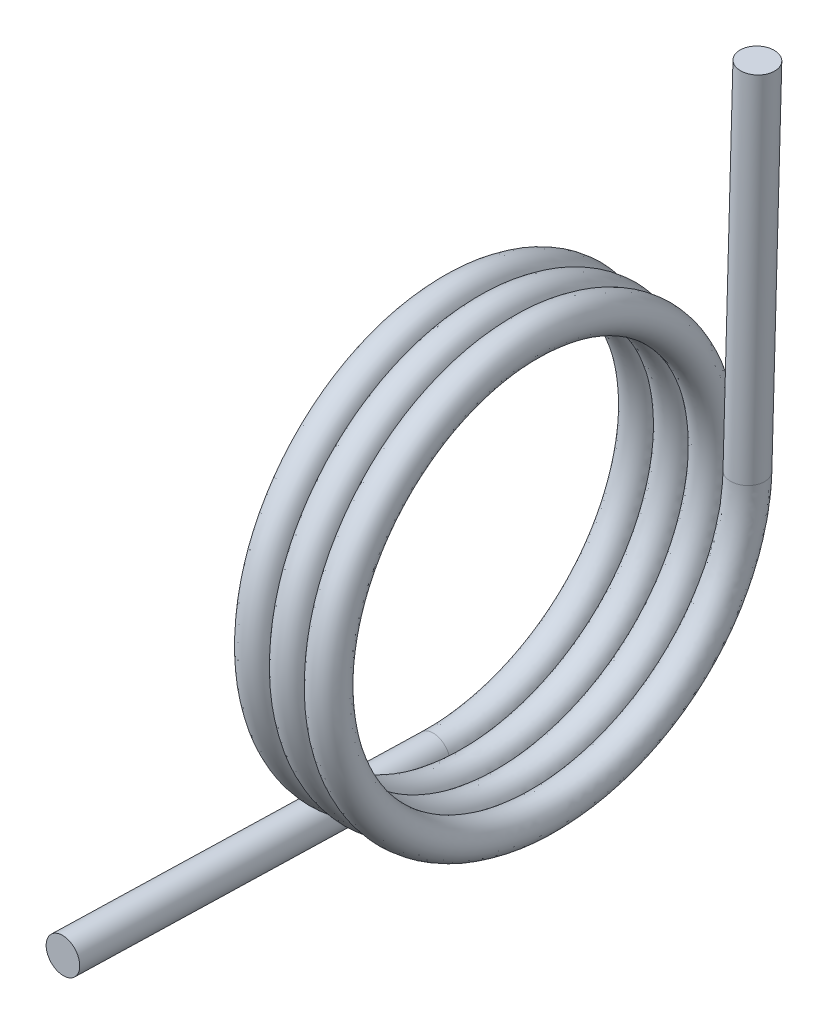
ISO-10303-21;
HEADER;
FILE_DESCRIPTION(('STEP AP214'),'2;1');
FILE_NAME('part.step','',(''),(''),'','','');
FILE_SCHEMA(('AUTOMOTIVE_DESIGN { 1 0 10303 214 1 1 1 1 }'));
ENDSEC;
DATA;
#1=APPLICATION_CONTEXT('core data for automotive mechanical design processes');
#2=APPLICATION_PROTOCOL_DEFINITION('international standard','automotive_design',2000,#1);
#3=PRODUCT_CONTEXT('',#1,'mechanical');
#4=PRODUCT('Part','Part','',(#3));
#5=PRODUCT_RELATED_PRODUCT_CATEGORY('part','',(#4));
#6=PRODUCT_DEFINITION_FORMATION('','',#4);
#7=PRODUCT_DEFINITION_CONTEXT('part definition',#1,'design');
#8=PRODUCT_DEFINITION('design','',#6,#7);
#9=PRODUCT_DEFINITION_SHAPE('','',#8);
#10=(LENGTH_UNIT() NAMED_UNIT(*) SI_UNIT(.MILLI.,.METRE.));
#11=(NAMED_UNIT(*) PLANE_ANGLE_UNIT() SI_UNIT($,.RADIAN.));
#12=(NAMED_UNIT(*) SI_UNIT($,.STERADIAN.) SOLID_ANGLE_UNIT());
#13=UNCERTAINTY_MEASURE_WITH_UNIT(LENGTH_MEASURE(1.E-05),#10,'distance_accuracy_value','');
#14=(GEOMETRIC_REPRESENTATION_CONTEXT(3) GLOBAL_UNCERTAINTY_ASSIGNED_CONTEXT((#13)) GLOBAL_UNIT_ASSIGNED_CONTEXT((#10,
#11,#12)) REPRESENTATION_CONTEXT('',''));
#15=CARTESIAN_POINT('',(0.,0.,0.));
#16=DIRECTION('',(0.,0.,1.));
#17=DIRECTION('',(1.,0.,0.));
#18=AXIS2_PLACEMENT_3D('',#15,#16,#17);
#19=CARTESIAN_POINT('',(-1.45994168900246,-16.9545,-0.0403796323986165));
#20=CARTESIAN_POINT('',(-1.21440835566913,-16.9311868083649,-9.82906477137413));
#21=CARTESIAN_POINT('',(-0.968875022335798,-8.44228021254733,-14.7032175246626));
#22=CARTESIAN_POINT('',(-0.723341689002465,0.0466263832702375,-19.577370277951));
#23=CARTESIAN_POINT('',(-0.477808355669133,8.51221978745268,-14.662837892264));
#24=CARTESIAN_POINT('',(-0.2322750223358,16.9778131916351,-9.7483055065769));
#25=CARTESIAN_POINT('',(0.013258310997533,16.9545,0.0403796323986144));
#26=CARTESIAN_POINT('',(0.258791644330866,16.9311868083649,9.82906477137412));
#27=CARTESIAN_POINT('',(0.504324977664198,8.44228021254733,14.7032175246626));
#28=CARTESIAN_POINT('',(0.749858310997531,-0.0466263832702351,19.577370277951));
#29=CARTESIAN_POINT('',(0.995391644330864,-8.51221978745267,14.662837892264));
#30=CARTESIAN_POINT('',(1.2409249776642,-16.9778131916351,9.74830550657691));
#31=CARTESIAN_POINT('',(1.48645831099753,-16.9545,-0.0403796323986165));
#32=CARTESIAN_POINT('',(1.73199164433086,-16.9311868083649,-9.82906477137413));
#33=CARTESIAN_POINT('',(1.97752497766419,-8.44228021254733,-14.7032175246626));
#34=CARTESIAN_POINT('',(2.22305831099753,0.0466263832702375,-19.577370277951));
#35=CARTESIAN_POINT('',(2.46859164433086,8.51221978745268,-14.662837892264));
#36=CARTESIAN_POINT('',(2.71412497766419,16.9778131916351,-9.7483055065769));
#37=CARTESIAN_POINT('',(2.95965831099753,16.9545,0.0403796323986144));
#38=CARTESIAN_POINT('',(3.20519164433086,16.9311868083649,9.82906477137412));
#39=CARTESIAN_POINT('',(3.45072497766419,8.44228021254733,14.7032175246626));
#40=CARTESIAN_POINT('',(3.69625831099752,-0.0466263832702351,19.577370277951));
#41=CARTESIAN_POINT('',(3.94179164433086,-8.51221978745267,14.662837892264));
#42=CARTESIAN_POINT('',(4.18732497766419,-16.9778131916351,9.74830550657691));
#43=CARTESIAN_POINT('',(4.43285831099752,-16.9545,-0.0403796323986165));
#44=CARTESIAN_POINT('',(4.67839164433085,-16.9311868083649,-9.82906477137413));
#45=CARTESIAN_POINT('',(4.92392497766419,-8.44228021254733,-14.7032175246626));
#46=CARTESIAN_POINT('',(5.16945831099752,0.0466263832702375,-19.577370277951));
#47=CARTESIAN_POINT('',(5.41499164433085,8.51221978745268,-14.662837892264));
#48=CARTESIAN_POINT('',(5.66052497766419,16.9778131916351,-9.7483055065769));
#49=CARTESIAN_POINT('',(5.90605831099752,16.9545,0.0403796323986144));
#50=CARTESIAN_POINT('',(6.15159164433085,16.9311868083649,9.82906477137412));
#51=CARTESIAN_POINT('',(6.39712497766418,8.44228021254733,14.7032175246626));
#52=CARTESIAN_POINT('',(6.64265831099752,-0.0466263832702351,19.577370277951));
#53=CARTESIAN_POINT('',(6.88819164433085,-8.51221978745267,14.662837892264));
#54=CARTESIAN_POINT('',(7.13372497766418,-16.9778131916351,9.74830550657691));
#55=CARTESIAN_POINT('',(7.37925831099752,-16.9545,-0.0403796323986165));
#56=CARTESIAN_POINT('',(7.62479164433085,-16.9311868083649,-9.82906477137413));
#57=CARTESIAN_POINT('',(7.87032497766418,-8.44228021254733,-14.7032175246626));
#58=CARTESIAN_POINT('',(8.11585831099752,0.0466263832702375,-19.577370277951));
#59=CARTESIAN_POINT('',(8.36139164433085,8.51221978745268,-14.662837892264));
#60=CARTESIAN_POINT('',(8.60692497766418,16.9778131916351,-9.7483055065769));
#61=CARTESIAN_POINT('',(8.85245831099751,16.9545,0.0403796323986144));
#62=CARTESIAN_POINT('',(9.09799164433085,16.9311868083649,9.82906477137412));
#63=CARTESIAN_POINT('',(9.34352497766418,8.44228021254733,14.7032175246626));
#64=CARTESIAN_POINT('',(9.58905831099751,-0.0466263832702351,19.577370277951));
#65=CARTESIAN_POINT('',(9.83459164433084,-8.51221978745267,14.662837892264));
#66=CARTESIAN_POINT('',(10.0801249776642,-16.9778131916351,9.74830550657691));
#67=CARTESIAN_POINT('',(10.3256583109975,-16.9545,-0.0403796323986165));
#68=CARTESIAN_POINT('',(-1.45994168900246,-14.0335,-0.0403796323985853));
#69=CARTESIAN_POINT('',(-1.21440835566913,-14.0101868083649,-8.1426246350712));
#70=CARTESIAN_POINT('',(-0.968875022335799,-6.98178021254735,-12.1735573202082));
#71=CARTESIAN_POINT('',(-0.723341689002466,0.0466263832702018,-16.2044900053452));
#72=CARTESIAN_POINT('',(-0.477808355669133,7.05171978745265,-12.1331776878096));
#73=CARTESIAN_POINT('',(-0.232275022335801,14.0568131916351,-8.06186537027403));
#74=CARTESIAN_POINT('',(0.0132583109975321,14.0335,0.0403796323985836));
#75=CARTESIAN_POINT('',(0.258791644330865,14.0101868083649,8.1426246350712));
#76=CARTESIAN_POINT('',(0.504324977664198,6.98178021254736,12.1735573202082));
#77=CARTESIAN_POINT('',(0.749858310997531,-0.0466263832701998,16.2044900053452));
#78=CARTESIAN_POINT('',(0.995391644330863,-7.05171978745265,12.1331776878096));
#79=CARTESIAN_POINT('',(1.2409249776642,-14.0568131916351,8.06186537027404));
#80=CARTESIAN_POINT('',(1.48645831099753,-14.0335,-0.0403796323985853));
#81=CARTESIAN_POINT('',(1.73199164433086,-14.0101868083649,-8.1426246350712));
#82=CARTESIAN_POINT('',(1.97752497766419,-6.98178021254735,-12.1735573202082));
#83=CARTESIAN_POINT('',(2.22305831099753,0.0466263832702018,-16.2044900053452));
#84=CARTESIAN_POINT('',(2.46859164433086,7.05171978745265,-12.1331776878096));
#85=CARTESIAN_POINT('',(2.71412497766419,14.0568131916351,-8.06186537027403));
#86=CARTESIAN_POINT('',(2.95965831099753,14.0335,0.0403796323985836));
#87=CARTESIAN_POINT('',(3.20519164433086,14.0101868083649,8.1426246350712));
#88=CARTESIAN_POINT('',(3.45072497766419,6.98178021254736,12.1735573202082));
#89=CARTESIAN_POINT('',(3.69625831099752,-0.0466263832701998,16.2044900053452));
#90=CARTESIAN_POINT('',(3.94179164433086,-7.05171978745265,12.1331776878096));
#91=CARTESIAN_POINT('',(4.18732497766419,-14.0568131916351,8.06186537027404));
#92=CARTESIAN_POINT('',(4.43285831099752,-14.0335,-0.0403796323985853));
#93=CARTESIAN_POINT('',(4.67839164433085,-14.0101868083649,-8.1426246350712));
#94=CARTESIAN_POINT('',(4.92392497766419,-6.98178021254735,-12.1735573202082));
#95=CARTESIAN_POINT('',(5.16945831099752,0.0466263832702018,-16.2044900053452));
#96=CARTESIAN_POINT('',(5.41499164433085,7.05171978745265,-12.1331776878096));
#97=CARTESIAN_POINT('',(5.66052497766418,14.0568131916351,-8.06186537027403));
#98=CARTESIAN_POINT('',(5.90605831099752,14.0335,0.0403796323985836));
#99=CARTESIAN_POINT('',(6.15159164433085,14.0101868083649,8.1426246350712));
#100=CARTESIAN_POINT('',(6.39712497766418,6.98178021254736,12.1735573202082));
#101=CARTESIAN_POINT('',(6.64265831099752,-0.0466263832701998,16.2044900053452));
#102=CARTESIAN_POINT('',(6.88819164433085,-7.05171978745265,12.1331776878096));
#103=CARTESIAN_POINT('',(7.13372497766418,-14.0568131916351,8.06186537027404));
#104=CARTESIAN_POINT('',(7.37925831099751,-14.0335,-0.0403796323985853));
#105=CARTESIAN_POINT('',(7.62479164433085,-14.0101868083649,-8.1426246350712));
#106=CARTESIAN_POINT('',(7.87032497766418,-6.98178021254735,-12.1735573202082));
#107=CARTESIAN_POINT('',(8.11585831099752,0.0466263832702018,-16.2044900053452));
#108=CARTESIAN_POINT('',(8.36139164433085,7.05171978745265,-12.1331776878096));
#109=CARTESIAN_POINT('',(8.60692497766418,14.0568131916351,-8.06186537027403));
#110=CARTESIAN_POINT('',(8.85245831099751,14.0335,0.0403796323985836));
#111=CARTESIAN_POINT('',(9.09799164433085,14.0101868083649,8.1426246350712));
#112=CARTESIAN_POINT('',(9.34352497766418,6.98178021254736,12.1735573202082));
#113=CARTESIAN_POINT('',(9.58905831099751,-0.0466263832701998,16.2044900053452));
#114=CARTESIAN_POINT('',(9.83459164433084,-7.05171978745265,12.1331776878096));
#115=CARTESIAN_POINT('',(10.0801249776642,-14.0568131916351,8.06186537027404));
#116=CARTESIAN_POINT('',(10.3256583109975,-14.0335,-0.0403796323985853));
#117=CARTESIAN_POINT('',(1.45994168900246,-14.0335,0.0403796323982925));
#118=CARTESIAN_POINT('',(1.7054750223358,-14.0568131916349,-8.06186537027432));
#119=CARTESIAN_POINT('',(1.95100835566913,-7.0517197874524,-12.1331776878098));
#120=CARTESIAN_POINT('',(2.19654168900246,-0.0466263832698656,-16.2044900053452));
#121=CARTESIAN_POINT('',(2.44207502233579,6.9817802125476,-12.1735573202081));
#122=CARTESIAN_POINT('',(2.68760835566913,14.0101868083651,-8.14262463507091));
#123=CARTESIAN_POINT('',(2.93314168900246,14.0335,-0.0403796323982942));
#124=CARTESIAN_POINT('',(3.17867502233579,14.0568131916349,8.06186537027432));
#125=CARTESIAN_POINT('',(3.42420835566913,7.05171978745241,12.1331776878098));
#126=CARTESIAN_POINT('',(3.66974168900246,0.0466263832698676,16.2044900053452));
#127=CARTESIAN_POINT('',(3.91527502233579,-6.98178021254759,12.1735573202081));
#128=CARTESIAN_POINT('',(4.16080835566912,-14.0101868083651,8.14262463507092));
#129=CARTESIAN_POINT('',(4.40634168900246,-14.0335,0.0403796323982925));
#130=CARTESIAN_POINT('',(4.65187502233579,-14.0568131916349,-8.06186537027432));
#131=CARTESIAN_POINT('',(4.89740835566912,-7.0517197874524,-12.1331776878098));
#132=CARTESIAN_POINT('',(5.14294168900245,-0.0466263832698656,-16.2044900053452));
#133=CARTESIAN_POINT('',(5.38847502233579,6.9817802125476,-12.1735573202081));
#134=CARTESIAN_POINT('',(5.63400835566912,14.0101868083651,-8.14262463507091));
#135=CARTESIAN_POINT('',(5.87954168900245,14.0335,-0.0403796323982942));
#136=CARTESIAN_POINT('',(6.12507502233579,14.0568131916349,8.06186537027432));
#137=CARTESIAN_POINT('',(6.37060835566912,7.05171978745241,12.1331776878098));
#138=CARTESIAN_POINT('',(6.61614168900245,0.0466263832698676,16.2044900053452));
#139=CARTESIAN_POINT('',(6.86167502233578,-6.98178021254759,12.1735573202081));
#140=CARTESIAN_POINT('',(7.10720835566912,-14.0101868083651,8.14262463507092));
#141=CARTESIAN_POINT('',(7.35274168900245,-14.0335,0.0403796323982925));
#142=CARTESIAN_POINT('',(7.59827502233578,-14.0568131916349,-8.06186537027432));
#143=CARTESIAN_POINT('',(7.84380835566911,-7.0517197874524,-12.1331776878098));
#144=CARTESIAN_POINT('',(8.08934168900245,-0.0466263832698656,-16.2044900053452));
#145=CARTESIAN_POINT('',(8.33487502233578,6.9817802125476,-12.1735573202081));
#146=CARTESIAN_POINT('',(8.58040835566911,14.0101868083651,-8.14262463507091));
#147=CARTESIAN_POINT('',(8.82594168900245,14.0335,-0.0403796323982942));
#148=CARTESIAN_POINT('',(9.07147502233578,14.0568131916349,8.06186537027432));
#149=CARTESIAN_POINT('',(9.31700835566911,7.05171978745241,12.1331776878098));
#150=CARTESIAN_POINT('',(9.56254168900244,0.0466263832698676,16.2044900053452));
#151=CARTESIAN_POINT('',(9.80807502233577,-6.98178021254759,12.1735573202081));
#152=CARTESIAN_POINT('',(10.0536083556691,-14.0101868083651,8.14262463507092));
#153=CARTESIAN_POINT('',(10.2991416890024,-14.0335,0.0403796323982925));
#154=CARTESIAN_POINT('',(10.5446750223358,-14.0568131916349,-8.06186537027432));
#155=CARTESIAN_POINT('',(10.7902083556691,-7.0517197874524,-12.1331776878098));
#156=CARTESIAN_POINT('',(11.0357416890024,-0.0466263832698656,-16.2044900053452));
#157=CARTESIAN_POINT('',(11.2812750223358,6.9817802125476,-12.1735573202081));
#158=CARTESIAN_POINT('',(11.5268083556691,14.0101868083651,-8.14262463507091));
#159=CARTESIAN_POINT('',(11.7723416890024,14.0335,-0.0403796323982942));
#160=CARTESIAN_POINT('',(12.0178750223358,14.0568131916349,8.06186537027432));
#161=CARTESIAN_POINT('',(12.2634083556691,7.05171978745241,12.1331776878098));
#162=CARTESIAN_POINT('',(12.5089416890024,0.0466263832698676,16.2044900053452));
#163=CARTESIAN_POINT('',(12.7544750223358,-6.98178021254759,12.1735573202081));
#164=CARTESIAN_POINT('',(13.0000083556691,-14.0101868083651,8.14262463507092));
#165=CARTESIAN_POINT('',(13.2455416890024,-14.0335,0.0403796323982925));
#166=CARTESIAN_POINT('',(1.45994168900246,-16.9545,0.0403796323982613));
#167=CARTESIAN_POINT('',(1.7054750223358,-16.9778131916349,-9.74830550657725));
#168=CARTESIAN_POINT('',(1.95100835566913,-8.51221978745238,-14.6628378922641));
#169=CARTESIAN_POINT('',(2.19654168900246,-0.0466263832698298,-19.577370277951));
#170=CARTESIAN_POINT('',(2.44207502233579,8.44228021254763,-14.7032175246624));
#171=CARTESIAN_POINT('',(2.68760835566913,16.9311868083651,-9.82906477137378));
#172=CARTESIAN_POINT('',(2.93314168900246,16.9545,-0.0403796323982634));
#173=CARTESIAN_POINT('',(3.17867502233579,16.9778131916349,9.74830550657725));
#174=CARTESIAN_POINT('',(3.42420835566913,8.51221978745238,14.6628378922641));
#175=CARTESIAN_POINT('',(3.66974168900246,0.0466263832698322,19.577370277951));
#176=CARTESIAN_POINT('',(3.91527502233579,-8.44228021254762,14.7032175246624));
#177=CARTESIAN_POINT('',(4.16080835566912,-16.9311868083651,9.82906477137378));
#178=CARTESIAN_POINT('',(4.40634168900246,-16.9545,0.0403796323982613));
#179=CARTESIAN_POINT('',(4.65187502233579,-16.9778131916349,-9.74830550657725));
#180=CARTESIAN_POINT('',(4.89740835566912,-8.51221978745238,-14.6628378922641));
#181=CARTESIAN_POINT('',(5.14294168900246,-0.0466263832698298,-19.577370277951));
#182=CARTESIAN_POINT('',(5.38847502233579,8.44228021254763,-14.7032175246624));
#183=CARTESIAN_POINT('',(5.63400835566912,16.9311868083651,-9.82906477137378));
#184=CARTESIAN_POINT('',(5.87954168900245,16.9545,-0.0403796323982634));
#185=CARTESIAN_POINT('',(6.12507502233579,16.9778131916349,9.74830550657725));
#186=CARTESIAN_POINT('',(6.37060835566912,8.51221978745238,14.6628378922641));
#187=CARTESIAN_POINT('',(6.61614168900245,0.0466263832698322,19.577370277951));
#188=CARTESIAN_POINT('',(6.86167502233578,-8.44228021254762,14.7032175246624));
#189=CARTESIAN_POINT('',(7.10720835566912,-16.9311868083651,9.82906477137378));
#190=CARTESIAN_POINT('',(7.35274168900245,-16.9545,0.0403796323982613));
#191=CARTESIAN_POINT('',(7.59827502233578,-16.9778131916349,-9.74830550657725));
#192=CARTESIAN_POINT('',(7.84380835566912,-8.51221978745238,-14.6628378922641));
#193=CARTESIAN_POINT('',(8.08934168900245,-0.0466263832698298,-19.577370277951));
#194=CARTESIAN_POINT('',(8.33487502233578,8.44228021254763,-14.7032175246624));
#195=CARTESIAN_POINT('',(8.58040835566911,16.9311868083651,-9.82906477137378));
#196=CARTESIAN_POINT('',(8.82594168900245,16.9545,-0.0403796323982634));
#197=CARTESIAN_POINT('',(9.07147502233578,16.9778131916349,9.74830550657725));
#198=CARTESIAN_POINT('',(9.31700835566911,8.51221978745238,14.6628378922641));
#199=CARTESIAN_POINT('',(9.56254168900244,0.0466263832698322,19.577370277951));
#200=CARTESIAN_POINT('',(9.80807502233578,-8.44228021254762,14.7032175246624));
#201=CARTESIAN_POINT('',(10.0536083556691,-16.9311868083651,9.82906477137378));
#202=CARTESIAN_POINT('',(10.2991416890024,-16.9545,0.0403796323982613));
#203=CARTESIAN_POINT('',(10.5446750223358,-16.9778131916349,-9.74830550657725));
#204=CARTESIAN_POINT('',(10.7902083556691,-8.51221978745238,-14.6628378922641));
#205=CARTESIAN_POINT('',(11.0357416890024,-0.0466263832698298,-19.577370277951));
#206=CARTESIAN_POINT('',(11.2812750223358,8.44228021254763,-14.7032175246624));
#207=CARTESIAN_POINT('',(11.5268083556691,16.9311868083651,-9.82906477137378));
#208=CARTESIAN_POINT('',(11.7723416890024,16.9545,-0.0403796323982634));
#209=CARTESIAN_POINT('',(12.0178750223358,16.9778131916349,9.74830550657725));
#210=CARTESIAN_POINT('',(12.2634083556691,8.51221978745238,14.6628378922641));
#211=CARTESIAN_POINT('',(12.5089416890024,0.0466263832698322,19.577370277951));
#212=CARTESIAN_POINT('',(12.7544750223358,-8.44228021254762,14.7032175246624));
#213=CARTESIAN_POINT('',(13.0000083556691,-16.9311868083651,9.82906477137378));
#214=CARTESIAN_POINT('',(13.2455416890024,-16.9545,0.0403796323982613));
#215=CARTESIAN_POINT('',(1.45994168900247,-19.8755,0.0403796323982302));
#216=CARTESIAN_POINT('',(1.7054750223358,-19.8988131916349,-11.4347456428802));
#217=CARTESIAN_POINT('',(1.95100835566913,-9.97271978745235,-17.1924980967185));
#218=CARTESIAN_POINT('',(2.19654168900246,-0.0466263832697941,-22.9502505505568));
#219=CARTESIAN_POINT('',(2.4420750223358,9.90278021254765,-17.2328777291167));
#220=CARTESIAN_POINT('',(2.68760835566913,19.8521868083651,-11.5155049076766));
#221=CARTESIAN_POINT('',(2.93314168900246,19.8755,-0.0403796323982326));
#222=CARTESIAN_POINT('',(3.17867502233579,19.8988131916349,11.4347456428802));
#223=CARTESIAN_POINT('',(3.42420835566913,9.97271978745236,17.1924980967185));
#224=CARTESIAN_POINT('',(3.66974168900246,0.0466263832697969,22.9502505505568));
#225=CARTESIAN_POINT('',(3.91527502233579,-9.90278021254765,17.2328777291167));
#226=CARTESIAN_POINT('',(4.16080835566913,-19.8521868083651,11.5155049076767));
#227=CARTESIAN_POINT('',(4.40634168900246,-19.8755,0.0403796323982302));
#228=CARTESIAN_POINT('',(4.65187502233579,-19.8988131916349,-11.4347456428802));
#229=CARTESIAN_POINT('',(4.89740835566912,-9.97271978745235,-17.1924980967185));
#230=CARTESIAN_POINT('',(5.14294168900246,-0.0466263832697941,-22.9502505505568));
#231=CARTESIAN_POINT('',(5.38847502233579,9.90278021254765,-17.2328777291167));
#232=CARTESIAN_POINT('',(5.63400835566912,19.8521868083651,-11.5155049076766));
#233=CARTESIAN_POINT('',(5.87954168900245,19.8755,-0.0403796323982326));
#234=CARTESIAN_POINT('',(6.12507502233579,19.8988131916349,11.4347456428802));
#235=CARTESIAN_POINT('',(6.37060835566912,9.97271978745236,17.1924980967185));
#236=CARTESIAN_POINT('',(6.61614168900245,0.0466263832697969,22.9502505505568));
#237=CARTESIAN_POINT('',(6.86167502233579,-9.90278021254765,17.2328777291167));
#238=CARTESIAN_POINT('',(7.10720835566912,-19.8521868083651,11.5155049076767));
#239=CARTESIAN_POINT('',(7.35274168900245,-19.8755,0.0403796323982302));
#240=CARTESIAN_POINT('',(7.59827502233578,-19.8988131916349,-11.4347456428802));
#241=CARTESIAN_POINT('',(7.84380835566912,-9.97271978745235,-17.1924980967185));
#242=CARTESIAN_POINT('',(8.08934168900245,-0.0466263832697941,-22.9502505505568));
#243=CARTESIAN_POINT('',(8.33487502233578,9.90278021254765,-17.2328777291167));
#244=CARTESIAN_POINT('',(8.58040835566912,19.8521868083651,-11.5155049076766));
#245=CARTESIAN_POINT('',(8.82594168900245,19.8755,-0.0403796323982326));
#246=CARTESIAN_POINT('',(9.07147502233578,19.8988131916349,11.4347456428802));
#247=CARTESIAN_POINT('',(9.31700835566911,9.97271978745236,17.1924980967185));
#248=CARTESIAN_POINT('',(9.56254168900245,0.0466263832697969,22.9502505505568));
#249=CARTESIAN_POINT('',(9.80807502233578,-9.90278021254765,17.2328777291167));
#250=CARTESIAN_POINT('',(10.0536083556691,-19.8521868083651,11.5155049076767));
#251=CARTESIAN_POINT('',(10.2991416890024,-19.8755,0.0403796323982302));
#252=CARTESIAN_POINT('',(10.5446750223358,-19.8988131916349,-11.4347456428802));
#253=CARTESIAN_POINT('',(10.7902083556691,-9.97271978745235,-17.1924980967185));
#254=CARTESIAN_POINT('',(11.0357416890024,-0.0466263832697941,-22.9502505505568));
#255=CARTESIAN_POINT('',(11.2812750223358,9.90278021254765,-17.2328777291167));
#256=CARTESIAN_POINT('',(11.5268083556691,19.8521868083651,-11.5155049076766));
#257=CARTESIAN_POINT('',(11.7723416890024,19.8755,-0.0403796323982326));
#258=CARTESIAN_POINT('',(12.0178750223358,19.8988131916349,11.4347456428802));
#259=CARTESIAN_POINT('',(12.2634083556691,9.97271978745236,17.1924980967185));
#260=CARTESIAN_POINT('',(12.5089416890024,0.0466263832697969,22.9502505505568));
#261=CARTESIAN_POINT('',(12.7544750223358,-9.90278021254765,17.2328777291167));
#262=CARTESIAN_POINT('',(13.0000083556691,-19.8521868083651,11.5155049076767));
#263=CARTESIAN_POINT('',(13.2455416890024,-19.8755,0.0403796323982302));
#264=CARTESIAN_POINT('',(-1.45994168900246,-19.8755,-0.0403796323986476));
#265=CARTESIAN_POINT('',(-1.21440835566913,-19.8521868083649,-11.5155049076771));
#266=CARTESIAN_POINT('',(-0.968875022335797,-9.9027802125473,-17.2328777291169));
#267=CARTESIAN_POINT('',(-0.723341689002464,0.0466263832702733,-22.9502505505568));
#268=CARTESIAN_POINT('',(-0.477808355669132,9.9727197874527,-17.1924980967183));
#269=CARTESIAN_POINT('',(-0.232275022335799,19.8988131916351,-11.4347456428798));
#270=CARTESIAN_POINT('',(0.0132583109975339,19.8755,0.0403796323986452));
#271=CARTESIAN_POINT('',(0.258791644330867,19.8521868083649,11.5155049076771));
#272=CARTESIAN_POINT('',(0.504324977664199,9.9027802125473,17.2328777291169));
#273=CARTESIAN_POINT('',(0.749858310997532,-0.0466263832702705,22.9502505505568));
#274=CARTESIAN_POINT('',(0.995391644330865,-9.97271978745269,17.1924980967183));
#275=CARTESIAN_POINT('',(1.2409249776642,-19.8988131916351,11.4347456428798));
#276=CARTESIAN_POINT('',(1.48645831099753,-19.8755,-0.0403796323986476));
#277=CARTESIAN_POINT('',(1.73199164433086,-19.8521868083649,-11.5155049076771));
#278=CARTESIAN_POINT('',(1.9775249776642,-9.9027802125473,-17.2328777291169));
#279=CARTESIAN_POINT('',(2.22305831099753,0.0466263832702733,-22.9502505505568));
#280=CARTESIAN_POINT('',(2.46859164433086,9.9727197874527,-17.1924980967183));
#281=CARTESIAN_POINT('',(2.71412497766419,19.8988131916351,-11.4347456428798));
#282=CARTESIAN_POINT('',(2.95965831099753,19.8755,0.0403796323986452));
#283=CARTESIAN_POINT('',(3.20519164433086,19.8521868083649,11.5155049076771));
#284=CARTESIAN_POINT('',(3.45072497766419,9.9027802125473,17.2328777291169));
#285=CARTESIAN_POINT('',(3.69625831099752,-0.0466263832702705,22.9502505505568));
#286=CARTESIAN_POINT('',(3.94179164433086,-9.97271978745269,17.1924980967183));
#287=CARTESIAN_POINT('',(4.18732497766419,-19.8988131916351,11.4347456428798));
#288=CARTESIAN_POINT('',(4.43285831099752,-19.8755,-0.0403796323986476));
#289=CARTESIAN_POINT('',(4.67839164433086,-19.8521868083649,-11.5155049076771));
#290=CARTESIAN_POINT('',(4.92392497766419,-9.9027802125473,-17.2328777291169));
#291=CARTESIAN_POINT('',(5.16945831099752,0.0466263832702733,-22.9502505505568));
#292=CARTESIAN_POINT('',(5.41499164433085,9.9727197874527,-17.1924980967183));
#293=CARTESIAN_POINT('',(5.66052497766419,19.8988131916351,-11.4347456428798));
#294=CARTESIAN_POINT('',(5.90605831099752,19.8755,0.0403796323986452));
#295=CARTESIAN_POINT('',(6.15159164433085,19.8521868083649,11.5155049076771));
#296=CARTESIAN_POINT('',(6.39712497766418,9.9027802125473,17.2328777291169));
#297=CARTESIAN_POINT('',(6.64265831099752,-0.0466263832702705,22.9502505505568));
#298=CARTESIAN_POINT('',(6.88819164433085,-9.97271978745269,17.1924980967183));
#299=CARTESIAN_POINT('',(7.13372497766418,-19.8988131916351,11.4347456428798));
#300=CARTESIAN_POINT('',(7.37925831099752,-19.8755,-0.0403796323986476));
#301=CARTESIAN_POINT('',(7.62479164433085,-19.8521868083649,-11.5155049076771));
#302=CARTESIAN_POINT('',(7.87032497766418,-9.9027802125473,-17.2328777291169));
#303=CARTESIAN_POINT('',(8.11585831099752,0.0466263832702733,-22.9502505505568));
#304=CARTESIAN_POINT('',(8.36139164433085,9.9727197874527,-17.1924980967183));
#305=CARTESIAN_POINT('',(8.60692497766418,19.8988131916351,-11.4347456428798));
#306=CARTESIAN_POINT('',(8.85245831099751,19.8755,0.0403796323986452));
#307=CARTESIAN_POINT('',(9.09799164433085,19.8521868083649,11.5155049076771));
#308=CARTESIAN_POINT('',(9.34352497766418,9.9027802125473,17.2328777291169));
#309=CARTESIAN_POINT('',(9.58905831099751,-0.0466263832702705,22.9502505505568));
#310=CARTESIAN_POINT('',(9.83459164433085,-9.97271978745269,17.1924980967183));
#311=CARTESIAN_POINT('',(10.0801249776642,-19.8988131916351,11.4347456428798));
#312=CARTESIAN_POINT('',(10.3256583109975,-19.8755,-0.0403796323986476));
#313=CARTESIAN_POINT('',(-1.45994168900246,-16.9545,-0.0403796323986165));
#314=CARTESIAN_POINT('',(-1.21440835566913,-16.9311868083649,-9.82906477137413));
#315=CARTESIAN_POINT('',(-0.968875022335798,-8.44228021254733,-14.7032175246626));
#316=CARTESIAN_POINT('',(-0.723341689002465,0.0466263832702375,-19.577370277951));
#317=CARTESIAN_POINT('',(-0.477808355669133,8.51221978745268,-14.662837892264));
#318=CARTESIAN_POINT('',(-0.2322750223358,16.9778131916351,-9.7483055065769));
#319=CARTESIAN_POINT('',(0.013258310997533,16.9545,0.0403796323986144));
#320=CARTESIAN_POINT('',(0.258791644330866,16.9311868083649,9.82906477137412));
#321=CARTESIAN_POINT('',(0.504324977664198,8.44228021254733,14.7032175246626));
#322=CARTESIAN_POINT('',(0.749858310997531,-0.0466263832702351,19.577370277951));
#323=CARTESIAN_POINT('',(0.995391644330864,-8.51221978745267,14.662837892264));
#324=CARTESIAN_POINT('',(1.2409249776642,-16.9778131916351,9.74830550657691));
#325=CARTESIAN_POINT('',(1.48645831099753,-16.9545,-0.0403796323986165));
#326=CARTESIAN_POINT('',(1.73199164433086,-16.9311868083649,-9.82906477137413));
#327=CARTESIAN_POINT('',(1.97752497766419,-8.44228021254733,-14.7032175246626));
#328=CARTESIAN_POINT('',(2.22305831099753,0.0466263832702375,-19.577370277951));
#329=CARTESIAN_POINT('',(2.46859164433086,8.51221978745268,-14.662837892264));
#330=CARTESIAN_POINT('',(2.71412497766419,16.9778131916351,-9.7483055065769));
#331=CARTESIAN_POINT('',(2.95965831099753,16.9545,0.0403796323986144));
#332=CARTESIAN_POINT('',(3.20519164433086,16.9311868083649,9.82906477137412));
#333=CARTESIAN_POINT('',(3.45072497766419,8.44228021254733,14.7032175246626));
#334=CARTESIAN_POINT('',(3.69625831099752,-0.0466263832702351,19.577370277951));
#335=CARTESIAN_POINT('',(3.94179164433086,-8.51221978745267,14.662837892264));
#336=CARTESIAN_POINT('',(4.18732497766419,-16.9778131916351,9.74830550657691));
#337=CARTESIAN_POINT('',(4.43285831099752,-16.9545,-0.0403796323986165));
#338=CARTESIAN_POINT('',(4.67839164433085,-16.9311868083649,-9.82906477137413));
#339=CARTESIAN_POINT('',(4.92392497766419,-8.44228021254733,-14.7032175246626));
#340=CARTESIAN_POINT('',(5.16945831099752,0.0466263832702375,-19.577370277951));
#341=CARTESIAN_POINT('',(5.41499164433085,8.51221978745268,-14.662837892264));
#342=CARTESIAN_POINT('',(5.66052497766419,16.9778131916351,-9.7483055065769));
#343=CARTESIAN_POINT('',(5.90605831099752,16.9545,0.0403796323986144));
#344=CARTESIAN_POINT('',(6.15159164433085,16.9311868083649,9.82906477137412));
#345=CARTESIAN_POINT('',(6.39712497766418,8.44228021254733,14.7032175246626));
#346=CARTESIAN_POINT('',(6.64265831099752,-0.0466263832702351,19.577370277951));
#347=CARTESIAN_POINT('',(6.88819164433085,-8.51221978745267,14.662837892264));
#348=CARTESIAN_POINT('',(7.13372497766418,-16.9778131916351,9.74830550657691));
#349=CARTESIAN_POINT('',(7.37925831099752,-16.9545,-0.0403796323986165));
#350=CARTESIAN_POINT('',(7.62479164433085,-16.9311868083649,-9.82906477137413));
#351=CARTESIAN_POINT('',(7.87032497766418,-8.44228021254733,-14.7032175246626));
#352=CARTESIAN_POINT('',(8.11585831099752,0.0466263832702375,-19.577370277951));
#353=CARTESIAN_POINT('',(8.36139164433085,8.51221978745268,-14.662837892264));
#354=CARTESIAN_POINT('',(8.60692497766418,16.9778131916351,-9.7483055065769));
#355=CARTESIAN_POINT('',(8.85245831099751,16.9545,0.0403796323986144));
#356=CARTESIAN_POINT('',(9.09799164433085,16.9311868083649,9.82906477137412));
#357=CARTESIAN_POINT('',(9.34352497766418,8.44228021254733,14.7032175246626));
#358=CARTESIAN_POINT('',(9.58905831099751,-0.0466263832702351,19.577370277951));
#359=CARTESIAN_POINT('',(9.83459164433084,-8.51221978745267,14.662837892264));
#360=CARTESIAN_POINT('',(10.0801249776642,-16.9778131916351,9.74830550657691));
#361=CARTESIAN_POINT('',(10.3256583109975,-16.9545,-0.0403796323986165));
#362=(BOUNDED_SURFACE() B_SPLINE_SURFACE(3,2,((#19,#20,#21,#22,#23,#24,#25,#26,#27,#28,#29,#30,
#31,#32,#33,#34,#35,#36,#37,#38,#39,#40,#41,#42,#43,#44,#45,#46,#47,#48,#49,#50,#51,#52,#53,#54,
#55,#56,#57,#58,#59,#60,#61,#62,#63,#64,#65,#66,#67),(#68,#69,#70,#71,#72,#73,#74,#75,#76,#77,
#78,#79,#80,#81,#82,#83,#84,#85,#86,#87,#88,#89,#90,#91,#92,#93,#94,#95,#96,#97,#98,#99,#100,
#101,#102,#103,#104,#105,#106,#107,#108,#109,#110,#111,#112,#113,#114,#115,#116),(#117,#118,
#119,#120,#121,#122,#123,#124,#125,#126,#127,#128,#129,#130,#131,#132,#133,#134,#135,#136,#137,
#138,#139,#140,#141,#142,#143,#144,#145,#146,#147,#148,#149,#150,#151,#152,#153,#154,#155,#156,
#157,#158,#159,#160,#161,#162,#163,#164,#165),(#166,#167,#168,#169,#170,#171,#172,#173,#174,
#175,#176,#177,#178,#179,#180,#181,#182,#183,#184,#185,#186,#187,#188,#189,#190,#191,#192,#193,
#194,#195,#196,#197,#198,#199,#200,#201,#202,#203,#204,#205,#206,#207,#208,#209,#210,#211,#212,
#213,#214),(#215,#216,#217,#218,#219,#220,#221,#222,#223,#224,#225,#226,#227,#228,#229,#230,
#231,#232,#233,#234,#235,#236,#237,#238,#239,#240,#241,#242,#243,#244,#245,#246,#247,#248,#249,
#250,#251,#252,#253,#254,#255,#256,#257,#258,#259,#260,#261,#262,#263),(#264,#265,#266,#267,
#268,#269,#270,#271,#272,#273,#274,#275,#276,#277,#278,#279,#280,#281,#282,#283,#284,#285,#286,
#287,#288,#289,#290,#291,#292,#293,#294,#295,#296,#297,#298,#299,#300,#301,#302,#303,#304,#305,
#306,#307,#308,#309,#310,#311,#312),(#313,#314,#315,#316,#317,#318,#319,#320,#321,#322,#323,
#324,#325,#326,#327,#328,#329,#330,#331,#332,#333,#334,#335,#336,#337,#338,#339,#340,#341,#342,
#343,#344,#345,#346,#347,#348,#349,#350,#351,#352,#353,#354,#355,#356,#357,#358,#359,#360,
#361)),.UNSPECIFIED.,.T.,.F.,.F.) B_SPLINE_SURFACE_WITH_KNOTS((4,3,4),(3,2,2,2,2,2,2,2,2,2,2,2,
2,2,2,2,2,2,2,2,2,2,2,2,3),(0.,0.5,1.),(0.,0.0416666666666667,0.0833333333333333,0.125,
0.166666666666667,0.208333333333333,0.25,0.291666666666667,0.333333333333333,0.375,
0.416666666666667,0.458333333333333,0.5,0.541666666666667,0.583333333333333,0.625,
0.666666666666667,0.708333333333333,0.75,0.791666666666667,0.833333333333333,0.875,
0.916666666666667,0.958333333333333,1.),
.UNSPECIFIED.) GEOMETRIC_REPRESENTATION_ITEM() RATIONAL_B_SPLINE_SURFACE(((1.,0.866025403784439,
1.,0.866025403784439,1.,0.866025403784439,1.,0.866025403784439,1.,0.866025403784439,1.,
0.866025403784439,1.,0.866025403784439,1.,0.866025403784439,1.,0.866025403784439,1.,
0.866025403784439,1.,0.866025403784439,1.,0.866025403784439,1.,0.866025403784439,1.,
0.866025403784439,1.,0.866025403784439,1.,0.866025403784439,1.,0.866025403784439,1.,
0.866025403784439,1.,0.866025403784439,1.,0.866025403784439,1.,0.866025403784439,1.,
0.866025403784439,1.,0.866025403784439,1.,0.866025403784439,1.),(0.333333333333333,
0.288675134594813,0.333333333333333,0.288675134594813,0.333333333333333,0.288675134594813,
0.333333333333333,0.288675134594813,0.333333333333333,0.288675134594813,0.333333333333333,
0.288675134594813,0.333333333333333,0.288675134594813,0.333333333333333,0.288675134594813,
0.333333333333333,0.288675134594813,0.333333333333333,0.288675134594813,0.333333333333333,
0.288675134594813,0.333333333333333,0.288675134594813,0.333333333333333,0.288675134594813,
0.333333333333333,0.288675134594813,0.333333333333333,0.288675134594813,0.333333333333333,
0.288675134594813,0.333333333333333,0.288675134594813,0.333333333333333,0.288675134594813,
0.333333333333333,0.288675134594813,0.333333333333333,0.288675134594813,0.333333333333333,
0.288675134594813,0.333333333333333,0.288675134594813,0.333333333333333,0.288675134594813,
0.333333333333333,0.288675134594813,0.333333333333333),(0.333333333333333,0.288675134594813,
0.333333333333333,0.288675134594813,0.333333333333333,0.288675134594813,0.333333333333333,
0.288675134594813,0.333333333333333,0.288675134594813,0.333333333333333,0.288675134594813,
0.333333333333333,0.288675134594813,0.333333333333333,0.288675134594813,0.333333333333333,
0.288675134594813,0.333333333333333,0.288675134594813,0.333333333333333,0.288675134594813,
0.333333333333333,0.288675134594813,0.333333333333333,0.288675134594813,0.333333333333333,
0.288675134594813,0.333333333333333,0.288675134594813,0.333333333333333,0.288675134594813,
0.333333333333333,0.288675134594813,0.333333333333333,0.288675134594813,0.333333333333333,
0.288675134594813,0.333333333333333,0.288675134594813,0.333333333333333,0.288675134594813,
0.333333333333333,0.288675134594813,0.333333333333333,0.288675134594813,0.333333333333333,
0.288675134594813,0.333333333333333),(1.,0.866025403784439,1.,0.866025403784439,1.,
0.866025403784439,1.,0.866025403784439,1.,0.866025403784439,1.,0.866025403784439,1.,
0.866025403784439,1.,0.866025403784439,1.,0.866025403784439,1.,0.866025403784439,1.,
0.866025403784439,1.,0.866025403784439,1.,0.866025403784439,1.,0.866025403784439,1.,
0.866025403784439,1.,0.866025403784439,1.,0.866025403784439,1.,0.866025403784439,1.,
0.866025403784439,1.,0.866025403784439,1.,0.866025403784439,1.,0.866025403784439,1.,
0.866025403784439,1.,0.866025403784439,1.),(0.333333333333333,0.288675134594813,
0.333333333333333,0.288675134594813,0.333333333333333,0.288675134594813,0.333333333333333,
0.288675134594813,0.333333333333333,0.288675134594813,0.333333333333333,0.288675134594813,
0.333333333333333,0.288675134594813,0.333333333333333,0.288675134594813,0.333333333333333,
0.288675134594813,0.333333333333333,0.288675134594813,0.333333333333333,0.288675134594813,
0.333333333333333,0.288675134594813,0.333333333333333,0.288675134594813,0.333333333333333,
0.288675134594813,0.333333333333333,0.288675134594813,0.333333333333333,0.288675134594813,
0.333333333333333,0.288675134594813,0.333333333333333,0.288675134594813,0.333333333333333,
0.288675134594813,0.333333333333333,0.288675134594813,0.333333333333333,0.288675134594813,
0.333333333333333,0.288675134594813,0.333333333333333,0.288675134594813,0.333333333333333,
0.288675134594813,0.333333333333333),(0.333333333333333,0.288675134594813,0.333333333333333,
0.288675134594813,0.333333333333333,0.288675134594813,0.333333333333333,0.288675134594813,
0.333333333333333,0.288675134594813,0.333333333333333,0.288675134594813,0.333333333333333,
0.288675134594813,0.333333333333333,0.288675134594813,0.333333333333333,0.288675134594813,
0.333333333333333,0.288675134594813,0.333333333333333,0.288675134594813,0.333333333333333,
0.288675134594813,0.333333333333333,0.288675134594813,0.333333333333333,0.288675134594813,
0.333333333333333,0.288675134594813,0.333333333333333,0.288675134594813,0.333333333333333,
0.288675134594813,0.333333333333333,0.288675134594813,0.333333333333333,0.288675134594813,
0.333333333333333,0.288675134594813,0.333333333333333,0.288675134594813,0.333333333333333,
0.288675134594813,0.333333333333333,0.288675134594813,0.333333333333333,0.288675134594813,
0.333333333333333),(1.,0.866025403784439,1.,0.866025403784439,1.,0.866025403784439,1.,
0.866025403784439,1.,0.866025403784439,1.,0.866025403784439,1.,0.866025403784439,1.,
0.866025403784439,1.,0.866025403784439,1.,0.866025403784439,1.,0.866025403784439,1.,
0.866025403784439,1.,0.866025403784439,1.,0.866025403784439,1.,0.866025403784439,1.,
0.866025403784439,1.,0.866025403784439,1.,0.866025403784439,1.,0.866025403784439,1.,
0.866025403784439,1.,0.866025403784439,1.,0.866025403784439,1.,0.866025403784439,1.,
0.866025403784439,1.))) REPRESENTATION_ITEM('') SURFACE());
#363=CARTESIAN_POINT('',(9.5758,9.17014854668109E-13,-16.9545));
#364=DIRECTION('',(0.0276478140352201,0.999617726122878,0.));
#365=DIRECTION('',(-0.999617726122878,0.0276478140352201,0.));
#366=AXIS2_PLACEMENT_3D('',#363,#364,#365);
#367=CIRCLE('',#366,1.4605);
#368=CARTESIAN_POINT('',(8.11585831099753,0.0403796323993559,-16.9545));
#369=VERTEX_POINT('',#368);
#370=EDGE_CURVE('E10',#369,#369,#367,.T.);
#371=CARTESIAN_POINT('',(0.,-16.9545,-1.80946566324253E-13));
#372=DIRECTION('',(-0.0276478140352201,0.,0.999617726122878));
#373=DIRECTION('',(0.999617726122878,0.,0.0276478140352201));
#374=AXIS2_PLACEMENT_3D('',#371,#372,#373);
#375=CIRCLE('',#374,1.4605);
#376=CARTESIAN_POINT('',(1.45994168900246,-16.9545,0.0403796323982579));
#377=VERTEX_POINT('',#376);
#378=EDGE_CURVE('E45',#377,#377,#375,.T.);
#379=ORIENTED_EDGE('',*,*,#370,.F.);
#380=EDGE_LOOP('',(#379));
#381=FACE_BOUND('',#380,.T.);
#382=ORIENTED_EDGE('',*,*,#378,.F.);
#383=EDGE_LOOP('',(#382));
#384=FACE_BOUND('',#383,.T.);
#385=ADVANCED_FACE('F33',(#381,#384),#362,.T.);
#386=CARTESIAN_POINT('',(-0.842705371793507,-16.9545000000003,30.4683482922252));
#387=DIRECTION('',(0.0276478140352201,0.,-0.999617726122878));
#388=DIRECTION('',(-0.999617726122878,0.,-0.0276478140352201));
#389=AXIS2_PLACEMENT_3D('',#386,#387,#388);
#390=CYLINDRICAL_SURFACE('',#389,1.4605);
#391=CARTESIAN_POINT('',(-0.842705371793507,-16.9545000000003,30.4683482922252));
#392=DIRECTION('',(-0.0276478140352201,0.,0.999617726122878));
#393=DIRECTION('',(0.999617726122878,0.,0.0276478140352201));
#394=AXIS2_PLACEMENT_3D('',#391,#392,#393);
#395=CIRCLE('',#394,1.4605);
#396=CARTESIAN_POINT('',(0.617236317208955,-16.9545000000003,30.5087279246236));
#397=VERTEX_POINT('',#396);
#398=EDGE_CURVE('E41',#397,#397,#395,.T.);
#399=ORIENTED_EDGE('',*,*,#398,.F.);
#400=EDGE_LOOP('',(#399));
#401=FACE_BOUND('',#400,.T.);
#402=ORIENTED_EDGE('',*,*,#378,.T.);
#403=EDGE_LOOP('',(#402));
#404=FACE_BOUND('',#403,.T.);
#405=ADVANCED_FACE('F66',(#401,#404),#390,.T.);
#406=CARTESIAN_POINT('',(-0.842705371793507,-16.9545000000003,30.4683482922252));
#407=DIRECTION('',(-0.0276478140352201,0.,0.999617726122878));
#408=DIRECTION('',(0.999617726122878,0.,0.0276478140352201));
#409=AXIS2_PLACEMENT_3D('',#406,#407,#408);
#410=PLANE('',#409);
#411=ORIENTED_EDGE('',*,*,#398,.T.);
#412=EDGE_LOOP('',(#411));
#413=FACE_BOUND('',#412,.T.);
#414=ADVANCED_FACE('F59',(#413),#410,.T.);
#415=CARTESIAN_POINT('',(10.4185053717935,30.4683482922265,-16.9544999999979));
#416=DIRECTION('',(-0.0276478140352201,-0.999617726122878,0.));
#417=DIRECTION('',(0.999617726122878,-0.0276478140352201,0.));
#418=AXIS2_PLACEMENT_3D('',#415,#416,#417);
#419=CYLINDRICAL_SURFACE('',#418,1.4605);
#420=CARTESIAN_POINT('',(10.4185053717935,30.4683482922265,-16.9544999999979));
#421=DIRECTION('',(0.0276478140352201,0.999617726122878,0.));
#422=DIRECTION('',(-0.999617726122878,0.0276478140352201,0.));
#423=AXIS2_PLACEMENT_3D('',#420,#421,#422);
#424=CIRCLE('',#423,1.4605);
#425=CARTESIAN_POINT('',(8.95856368279104,30.5087279246249,-16.9544999999979));
#426=VERTEX_POINT('',#425);
#427=EDGE_CURVE('E50',#426,#426,#424,.T.);
#428=ORIENTED_EDGE('',*,*,#427,.F.);
#429=EDGE_LOOP('',(#428));
#430=FACE_BOUND('',#429,.T.);
#431=ORIENTED_EDGE('',*,*,#370,.T.);
#432=EDGE_LOOP('',(#431));
#433=FACE_BOUND('',#432,.T.);
#434=ADVANCED_FACE('F57',(#430,#433),#419,.T.);
#435=CARTESIAN_POINT('',(10.4185053717935,30.4683482922265,-16.9544999999979));
#436=DIRECTION('',(0.0276478140352201,0.999617726122878,0.));
#437=DIRECTION('',(-0.999617726122878,0.0276478140352201,0.));
#438=AXIS2_PLACEMENT_3D('',#435,#436,#437);
#439=PLANE('',#438);
#440=ORIENTED_EDGE('',*,*,#427,.T.);
#441=EDGE_LOOP('',(#440));
#442=FACE_BOUND('',#441,.T.);
#443=ADVANCED_FACE('F55',(#442),#439,.T.);
#444=CLOSED_SHELL('',(#385,#405,#414,#434,#443));
#445=MANIFOLD_SOLID_BREP('B2',#444);
#446=ADVANCED_BREP_SHAPE_REPRESENTATION('',(#18,#445),#14);
#447=SHAPE_DEFINITION_REPRESENTATION(#9,#446);
ENDSEC;
END-ISO-10303-21;
